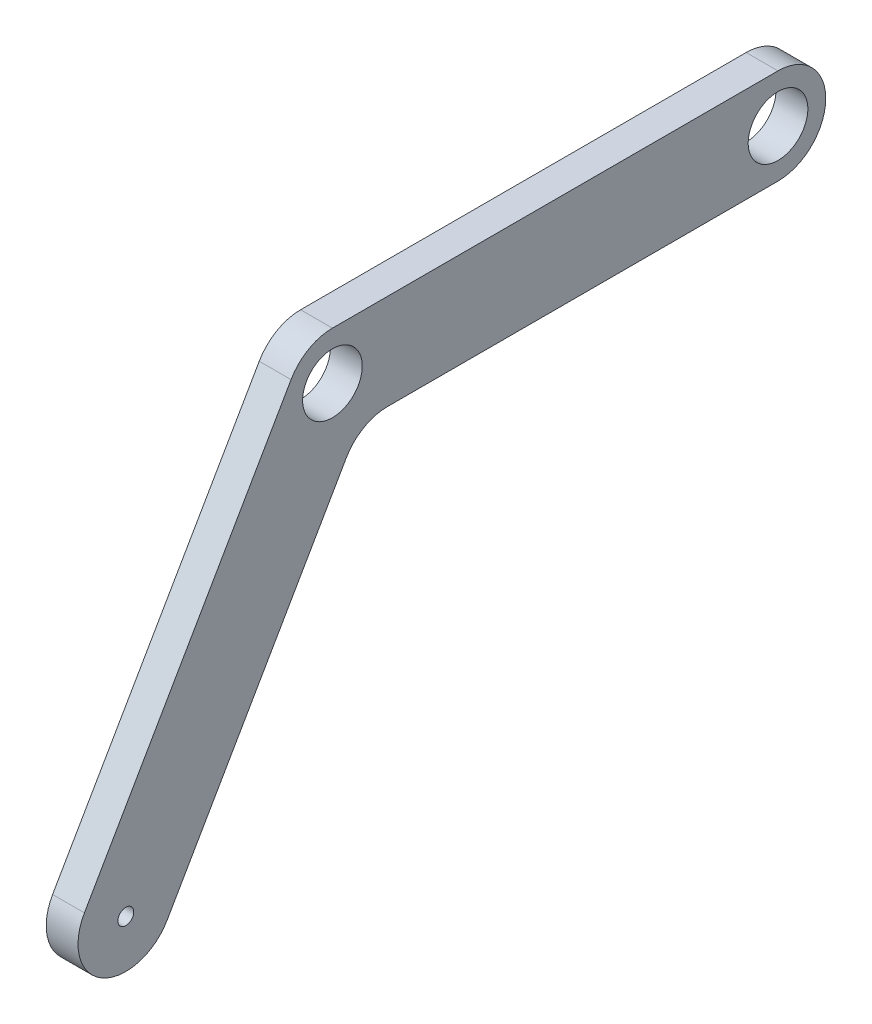
ISO-10303-21;
HEADER;
FILE_DESCRIPTION(('STEP AP214'),'2;1');
FILE_NAME('part.step','',(''),(''),'','','');
FILE_SCHEMA(('AUTOMOTIVE_DESIGN { 1 0 10303 214 1 1 1 1 }'));
ENDSEC;
DATA;
#1=APPLICATION_CONTEXT('core data for automotive mechanical design processes');
#2=APPLICATION_PROTOCOL_DEFINITION('international standard','automotive_design',2000,#1);
#3=PRODUCT_CONTEXT('',#1,'mechanical');
#4=PRODUCT('Part','Part','',(#3));
#5=PRODUCT_RELATED_PRODUCT_CATEGORY('part','',(#4));
#6=PRODUCT_DEFINITION_FORMATION('','',#4);
#7=PRODUCT_DEFINITION_CONTEXT('part definition',#1,'design');
#8=PRODUCT_DEFINITION('design','',#6,#7);
#9=PRODUCT_DEFINITION_SHAPE('','',#8);
#10=(LENGTH_UNIT() NAMED_UNIT(*) SI_UNIT(.MILLI.,.METRE.));
#11=(NAMED_UNIT(*) PLANE_ANGLE_UNIT() SI_UNIT($,.RADIAN.));
#12=(NAMED_UNIT(*) SI_UNIT($,.STERADIAN.) SOLID_ANGLE_UNIT());
#13=UNCERTAINTY_MEASURE_WITH_UNIT(LENGTH_MEASURE(1.E-05),#10,'distance_accuracy_value','');
#14=(GEOMETRIC_REPRESENTATION_CONTEXT(3) GLOBAL_UNCERTAINTY_ASSIGNED_CONTEXT((#13)) GLOBAL_UNIT_ASSIGNED_CONTEXT((#10,
#11,#12)) REPRESENTATION_CONTEXT('',''));
#15=CARTESIAN_POINT('',(0.,0.,0.));
#16=DIRECTION('',(0.,0.,1.));
#17=DIRECTION('',(1.,0.,0.));
#18=AXIS2_PLACEMENT_3D('',#15,#16,#17);
#19=CARTESIAN_POINT('',(-50.,-150.,-86.6717052534844));
#20=DIRECTION('',(-1.,0.,0.));
#21=DIRECTION('',(0.,0.,1.));
#22=AXIS2_PLACEMENT_3D('',#19,#20,#21);
#23=PLANE('',#22);
#24=CARTESIAN_POINT('',(-50.,0.,0.));
#25=DIRECTION('',(-1.,0.,0.));
#26=DIRECTION('',(0.,0.,1.));
#27=AXIS2_PLACEMENT_3D('',#24,#25,#26);
#28=CIRCLE('',#27,46.875);
#29=CARTESIAN_POINT('',(-50.,0.,46.875));
#30=VERTEX_POINT('',#29);
#31=EDGE_CURVE('E181',#30,#30,#28,.T.);
#32=ORIENTED_EDGE('',*,*,#31,.F.);
#33=EDGE_LOOP('',(#32));
#34=FACE_BOUND('',#33,.T.);
#35=CARTESIAN_POINT('',(-50.,-150.,-86.6717052534844));
#36=DIRECTION('',(1.,0.,0.));
#37=DIRECTION('',(0.,0.,1.));
#38=AXIS2_PLACEMENT_3D('',#35,#36,#37);
#39=CIRCLE('',#38,75.);
#40=CARTESIAN_POINT('',(-50.,-75.,-86.6717052534844));
#41=VERTEX_POINT('',#40);
#42=CARTESIAN_POINT('',(-50.,-112.544923896965,-21.6938838517485));
#43=VERTEX_POINT('',#42);
#44=EDGE_CURVE('E144',#41,#43,#39,.T.);
#45=ORIENTED_EDGE('',*,*,#44,.T.);
#46=DIRECTION('',(0.,-0.866370952023145,0.499401014707129));
#47=VECTOR('',#46,1.);
#48=CARTESIAN_POINT('',(-50.,-112.544923896965,-21.6938838517485));
#49=LINE('',#48,#47);
#50=CARTESIAN_POINT('',(-50.,-600.596194918079,259.632838157898));
#51=VERTEX_POINT('',#50);
#52=EDGE_CURVE('E92',#43,#51,#49,.T.);
#53=ORIENTED_EDGE('',*,*,#52,.T.);
#54=CARTESIAN_POINT('',(-50.,-563.141118815044,324.610659559634));
#55=DIRECTION('',(-1.,0.,0.));
#56=DIRECTION('',(0.,0.,1.));
#57=AXIS2_PLACEMENT_3D('',#54,#55,#56);
#58=CIRCLE('',#57,75.);
#59=CARTESIAN_POINT('',(-50.,-525.68604271201,389.588480961369));
#60=VERTEX_POINT('',#59);
#61=EDGE_CURVE('E159',#51,#60,#58,.T.);
#62=ORIENTED_EDGE('',*,*,#61,.T.);
#63=DIRECTION('',(0.,0.866370952023145,-0.499401014707129));
#64=VECTOR('',#63,1.);
#65=CARTESIAN_POINT('',(-50.,37.4550761030346,64.9778214017358));
#66=LINE('',#65,#64);
#67=CARTESIAN_POINT('',(-50.,37.4550761030346,64.9778214017358));
#68=VERTEX_POINT('',#67);
#69=EDGE_CURVE('E172',#60,#68,#66,.T.);
#70=ORIENTED_EDGE('',*,*,#69,.T.);
#71=CARTESIAN_POINT('',(-50.,0.,0.));
#72=DIRECTION('',(-1.,0.,0.));
#73=DIRECTION('',(0.,0.,1.));
#74=AXIS2_PLACEMENT_3D('',#71,#72,#73);
#75=CIRCLE('',#74,75.);
#76=CARTESIAN_POINT('',(-50.,75.,0.));
#77=VERTEX_POINT('',#76);
#78=EDGE_CURVE('E111',#68,#77,#75,.T.);
#79=ORIENTED_EDGE('',*,*,#78,.T.);
#80=DIRECTION('',(0.,0.,-1.));
#81=VECTOR('',#80,1.);
#82=CARTESIAN_POINT('',(-50.,75.,0.));
#83=LINE('',#82,#81);
#84=CARTESIAN_POINT('',(-50.,74.9999999999999,-700.));
#85=VERTEX_POINT('',#84);
#86=EDGE_CURVE('E105',#77,#85,#83,.T.);
#87=ORIENTED_EDGE('',*,*,#86,.T.);
#88=CARTESIAN_POINT('',(-50.,0.,-700.));
#89=DIRECTION('',(-1.,0.,0.));
#90=DIRECTION('',(0.,0.,1.));
#91=AXIS2_PLACEMENT_3D('',#88,#89,#90);
#92=CIRCLE('',#91,75.);
#93=CARTESIAN_POINT('',(-50.,-75.,-700.));
#94=VERTEX_POINT('',#93);
#95=EDGE_CURVE('E109',#85,#94,#92,.T.);
#96=ORIENTED_EDGE('',*,*,#95,.T.);
#97=DIRECTION('',(0.,0.,1.));
#98=VECTOR('',#97,1.);
#99=CARTESIAN_POINT('',(-50.,-75.,-86.6717052534844));
#100=LINE('',#99,#98);
#101=EDGE_CURVE('E49',#94,#41,#100,.T.);
#102=ORIENTED_EDGE('',*,*,#101,.T.);
#103=EDGE_LOOP('',(#45,#53,#62,#70,#79,#87,#96,#102));
#104=FACE_BOUND('',#103,.T.);
#105=CARTESIAN_POINT('',(-50.,0.,-700.));
#106=DIRECTION('',(-1.,0.,0.));
#107=DIRECTION('',(0.,0.,1.));
#108=AXIS2_PLACEMENT_3D('',#105,#106,#107);
#109=CIRCLE('',#108,46.875);
#110=CARTESIAN_POINT('',(-50.,0.,-653.125));
#111=VERTEX_POINT('',#110);
#112=EDGE_CURVE('E133',#111,#111,#109,.T.);
#113=ORIENTED_EDGE('',*,*,#112,.F.);
#114=EDGE_LOOP('',(#113));
#115=FACE_BOUND('',#114,.T.);
#116=CARTESIAN_POINT('',(-50.,-563.141118815045,324.610659559632));
#117=DIRECTION('',(-1.,0.,0.));
#118=DIRECTION('',(0.,0.,1.));
#119=AXIS2_PLACEMENT_3D('',#116,#117,#118);
#120=CIRCLE('',#119,12.5000000000018);
#121=CARTESIAN_POINT('',(-50.,-563.141118815045,337.110659559634));
#122=VERTEX_POINT('',#121);
#123=EDGE_CURVE('E187',#122,#122,#120,.T.);
#124=ORIENTED_EDGE('',*,*,#123,.F.);
#125=EDGE_LOOP('',(#124));
#126=FACE_BOUND('',#125,.T.);
#127=ADVANCED_FACE('F32',(#34,#104,#115,#126),#23,.T.);
#128=CARTESIAN_POINT('',(0.,-150.,-86.6717052534844));
#129=DIRECTION('',(-1.,0.,0.));
#130=DIRECTION('',(0.,0.,1.));
#131=AXIS2_PLACEMENT_3D('',#128,#129,#130);
#132=PLANE('',#131);
#133=CARTESIAN_POINT('',(0.,0.,0.));
#134=DIRECTION('',(-1.,0.,0.));
#135=DIRECTION('',(0.,0.,1.));
#136=AXIS2_PLACEMENT_3D('',#133,#134,#135);
#137=CIRCLE('',#136,46.875);
#138=CARTESIAN_POINT('',(0.,0.,46.875));
#139=VERTEX_POINT('',#138);
#140=EDGE_CURVE('E184',#139,#139,#137,.T.);
#141=ORIENTED_EDGE('',*,*,#140,.T.);
#142=EDGE_LOOP('',(#141));
#143=FACE_BOUND('',#142,.T.);
#144=CARTESIAN_POINT('',(0.,-150.,-86.6717052534844));
#145=DIRECTION('',(1.,0.,0.));
#146=DIRECTION('',(0.,0.,1.));
#147=AXIS2_PLACEMENT_3D('',#144,#145,#146);
#148=CIRCLE('',#147,75.);
#149=CARTESIAN_POINT('',(0.,-75.,-86.6717052534844));
#150=VERTEX_POINT('',#149);
#151=CARTESIAN_POINT('',(0.,-112.544923896965,-21.6938838517485));
#152=VERTEX_POINT('',#151);
#153=EDGE_CURVE('E129',#150,#152,#148,.T.);
#154=ORIENTED_EDGE('',*,*,#153,.F.);
#155=DIRECTION('',(0.,0.,1.));
#156=VECTOR('',#155,1.);
#157=CARTESIAN_POINT('',(0.,-75.,-86.6717052534844));
#158=LINE('',#157,#156);
#159=CARTESIAN_POINT('',(0.,-75.,-700.));
#160=VERTEX_POINT('',#159);
#161=EDGE_CURVE('E84',#160,#150,#158,.T.);
#162=ORIENTED_EDGE('',*,*,#161,.F.);
#163=CARTESIAN_POINT('',(0.,0.,-700.));
#164=DIRECTION('',(-1.,0.,0.));
#165=DIRECTION('',(0.,0.,1.));
#166=AXIS2_PLACEMENT_3D('',#163,#164,#165);
#167=CIRCLE('',#166,75.);
#168=CARTESIAN_POINT('',(0.,74.9999999999999,-700.));
#169=VERTEX_POINT('',#168);
#170=EDGE_CURVE('E78',#169,#160,#167,.T.);
#171=ORIENTED_EDGE('',*,*,#170,.F.);
#172=DIRECTION('',(0.,0.,-1.));
#173=VECTOR('',#172,1.);
#174=CARTESIAN_POINT('',(0.,75.,0.));
#175=LINE('',#174,#173);
#176=CARTESIAN_POINT('',(0.,75.,0.));
#177=VERTEX_POINT('',#176);
#178=EDGE_CURVE('E119',#177,#169,#175,.T.);
#179=ORIENTED_EDGE('',*,*,#178,.F.);
#180=CARTESIAN_POINT('',(0.,0.,0.));
#181=DIRECTION('',(-1.,0.,0.));
#182=DIRECTION('',(0.,0.,1.));
#183=AXIS2_PLACEMENT_3D('',#180,#181,#182);
#184=CIRCLE('',#183,75.);
#185=CARTESIAN_POINT('',(0.,37.4550761030346,64.9778214017358));
#186=VERTEX_POINT('',#185);
#187=EDGE_CURVE('E139',#186,#177,#184,.T.);
#188=ORIENTED_EDGE('',*,*,#187,.F.);
#189=DIRECTION('',(0.,0.866370952023145,-0.499401014707129));
#190=VECTOR('',#189,1.);
#191=CARTESIAN_POINT('',(0.,37.4550761030346,64.9778214017358));
#192=LINE('',#191,#190);
#193=CARTESIAN_POINT('',(0.,-525.68604271201,389.588480961369));
#194=VERTEX_POINT('',#193);
#195=EDGE_CURVE('E137',#194,#186,#192,.T.);
#196=ORIENTED_EDGE('',*,*,#195,.F.);
#197=CARTESIAN_POINT('',(0.,-563.141118815044,324.610659559634));
#198=DIRECTION('',(-1.,0.,0.));
#199=DIRECTION('',(0.,0.,1.));
#200=AXIS2_PLACEMENT_3D('',#197,#198,#199);
#201=CIRCLE('',#200,75.);
#202=CARTESIAN_POINT('',(0.,-600.596194918079,259.632838157898));
#203=VERTEX_POINT('',#202);
#204=EDGE_CURVE('E135',#203,#194,#201,.T.);
#205=ORIENTED_EDGE('',*,*,#204,.F.);
#206=DIRECTION('',(0.,-0.866370952023145,0.499401014707129));
#207=VECTOR('',#206,1.);
#208=CARTESIAN_POINT('',(0.,-112.544923896965,-21.6938838517485));
#209=LINE('',#208,#207);
#210=EDGE_CURVE('E132',#152,#203,#209,.T.);
#211=ORIENTED_EDGE('',*,*,#210,.F.);
#212=EDGE_LOOP('',(#154,#162,#171,#179,#188,#196,#205,#211));
#213=FACE_BOUND('',#212,.T.);
#214=CARTESIAN_POINT('',(0.,0.,-700.));
#215=DIRECTION('',(-1.,0.,0.));
#216=DIRECTION('',(0.,0.,1.));
#217=AXIS2_PLACEMENT_3D('',#214,#215,#216);
#218=CIRCLE('',#217,46.875);
#219=CARTESIAN_POINT('',(0.,0.,-653.125));
#220=VERTEX_POINT('',#219);
#221=EDGE_CURVE('E178',#220,#220,#218,.T.);
#222=ORIENTED_EDGE('',*,*,#221,.T.);
#223=EDGE_LOOP('',(#222));
#224=FACE_BOUND('',#223,.T.);
#225=CARTESIAN_POINT('',(0.,-563.141118815045,324.610659559632));
#226=DIRECTION('',(-1.,0.,0.));
#227=DIRECTION('',(0.,0.,1.));
#228=AXIS2_PLACEMENT_3D('',#225,#226,#227);
#229=CIRCLE('',#228,12.5000000000018);
#230=CARTESIAN_POINT('',(0.,-563.141118815045,337.110659559634));
#231=VERTEX_POINT('',#230);
#232=EDGE_CURVE('E190',#231,#231,#229,.T.);
#233=ORIENTED_EDGE('',*,*,#232,.T.);
#234=EDGE_LOOP('',(#233));
#235=FACE_BOUND('',#234,.T.);
#236=ADVANCED_FACE('F163',(#143,#213,#224,#235),#132,.F.);
#237=CARTESIAN_POINT('',(-50.,-150.,-86.6717052534844));
#238=DIRECTION('',(1.,0.,0.));
#239=DIRECTION('',(0.,0.,-1.));
#240=AXIS2_PLACEMENT_3D('',#237,#238,#239);
#241=CYLINDRICAL_SURFACE('',#240,75.);
#242=ORIENTED_EDGE('',*,*,#153,.T.);
#243=DIRECTION('',(1.,0.,0.));
#244=VECTOR('',#243,1.);
#245=CARTESIAN_POINT('',(-50.,-112.544923896965,-21.6938838517485));
#246=LINE('',#245,#244);
#247=EDGE_CURVE('E11',#43,#152,#246,.T.);
#248=ORIENTED_EDGE('',*,*,#247,.F.);
#249=ORIENTED_EDGE('',*,*,#44,.F.);
#250=DIRECTION('',(1.,0.,0.));
#251=VECTOR('',#250,1.);
#252=CARTESIAN_POINT('',(-50.,-75.,-86.6717052534844));
#253=LINE('',#252,#251);
#254=EDGE_CURVE('E125',#41,#150,#253,.T.);
#255=ORIENTED_EDGE('',*,*,#254,.T.);
#256=EDGE_LOOP('',(#242,#248,#249,#255));
#257=FACE_BOUND('',#256,.T.);
#258=ADVANCED_FACE('F34',(#257),#241,.F.);
#259=CARTESIAN_POINT('',(-50.,-112.544923896965,-21.6938838517485));
#260=DIRECTION('',(0.,0.499401014707129,0.866370952023145));
#261=DIRECTION('',(0.,-0.866370952023145,0.499401014707129));
#262=AXIS2_PLACEMENT_3D('',#259,#260,#261);
#263=PLANE('',#262);
#264=ORIENTED_EDGE('',*,*,#210,.T.);
#265=DIRECTION('',(1.,0.,0.));
#266=VECTOR('',#265,1.);
#267=CARTESIAN_POINT('',(-50.,-600.596194918079,259.632838157898));
#268=LINE('',#267,#266);
#269=EDGE_CURVE('E41',#51,#203,#268,.T.);
#270=ORIENTED_EDGE('',*,*,#269,.F.);
#271=ORIENTED_EDGE('',*,*,#52,.F.);
#272=ORIENTED_EDGE('',*,*,#247,.T.);
#273=EDGE_LOOP('',(#264,#270,#271,#272));
#274=FACE_BOUND('',#273,.T.);
#275=ADVANCED_FACE('F224',(#274),#263,.F.);
#276=CARTESIAN_POINT('',(-50.,-563.141118815044,324.610659559634));
#277=DIRECTION('',(1.,0.,0.));
#278=DIRECTION('',(0.,0.,-1.));
#279=AXIS2_PLACEMENT_3D('',#276,#277,#278);
#280=CYLINDRICAL_SURFACE('',#279,75.);
#281=ORIENTED_EDGE('',*,*,#204,.T.);
#282=DIRECTION('',(1.,0.,0.));
#283=VECTOR('',#282,1.);
#284=CARTESIAN_POINT('',(-50.,-525.68604271201,389.588480961369));
#285=LINE('',#284,#283);
#286=EDGE_CURVE('E151',#60,#194,#285,.T.);
#287=ORIENTED_EDGE('',*,*,#286,.F.);
#288=ORIENTED_EDGE('',*,*,#61,.F.);
#289=ORIENTED_EDGE('',*,*,#269,.T.);
#290=EDGE_LOOP('',(#281,#287,#288,#289));
#291=FACE_BOUND('',#290,.T.);
#292=ADVANCED_FACE('F157',(#291),#280,.T.);
#293=CARTESIAN_POINT('',(-50.,37.4550761030346,64.9778214017358));
#294=DIRECTION('',(0.,-0.499401014707129,-0.866370952023145));
#295=DIRECTION('',(0.,0.866370952023145,-0.499401014707129));
#296=AXIS2_PLACEMENT_3D('',#293,#294,#295);
#297=PLANE('',#296);
#298=ORIENTED_EDGE('',*,*,#195,.T.);
#299=DIRECTION('',(1.,0.,0.));
#300=VECTOR('',#299,1.);
#301=CARTESIAN_POINT('',(-50.,37.4550761030346,64.9778214017358));
#302=LINE('',#301,#300);
#303=EDGE_CURVE('E148',#68,#186,#302,.T.);
#304=ORIENTED_EDGE('',*,*,#303,.F.);
#305=ORIENTED_EDGE('',*,*,#69,.F.);
#306=ORIENTED_EDGE('',*,*,#286,.T.);
#307=EDGE_LOOP('',(#298,#304,#305,#306));
#308=FACE_BOUND('',#307,.T.);
#309=ADVANCED_FACE('F168',(#308),#297,.F.);
#310=CARTESIAN_POINT('',(-50.,0.,0.));
#311=DIRECTION('',(1.,0.,0.));
#312=DIRECTION('',(0.,0.,-1.));
#313=AXIS2_PLACEMENT_3D('',#310,#311,#312);
#314=CYLINDRICAL_SURFACE('',#313,75.);
#315=ORIENTED_EDGE('',*,*,#187,.T.);
#316=DIRECTION('',(1.,0.,0.));
#317=VECTOR('',#316,1.);
#318=CARTESIAN_POINT('',(-50.,75.,0.));
#319=LINE('',#318,#317);
#320=EDGE_CURVE('E120',#77,#177,#319,.T.);
#321=ORIENTED_EDGE('',*,*,#320,.F.);
#322=ORIENTED_EDGE('',*,*,#78,.F.);
#323=ORIENTED_EDGE('',*,*,#303,.T.);
#324=EDGE_LOOP('',(#315,#321,#322,#323));
#325=FACE_BOUND('',#324,.T.);
#326=ADVANCED_FACE('F171',(#325),#314,.T.);
#327=CARTESIAN_POINT('',(-50.,75.,0.));
#328=DIRECTION('',(0.,-1.,0.));
#329=DIRECTION('',(0.,0.,-1.));
#330=AXIS2_PLACEMENT_3D('',#327,#328,#329);
#331=PLANE('',#330);
#332=ORIENTED_EDGE('',*,*,#178,.T.);
#333=DIRECTION('',(1.,0.,0.));
#334=VECTOR('',#333,1.);
#335=CARTESIAN_POINT('',(-50.,74.9999999999999,-700.));
#336=LINE('',#335,#334);
#337=EDGE_CURVE('E116',#85,#169,#336,.T.);
#338=ORIENTED_EDGE('',*,*,#337,.F.);
#339=ORIENTED_EDGE('',*,*,#86,.F.);
#340=ORIENTED_EDGE('',*,*,#320,.T.);
#341=EDGE_LOOP('',(#332,#338,#339,#340));
#342=FACE_BOUND('',#341,.T.);
#343=ADVANCED_FACE('F117',(#342),#331,.F.);
#344=CARTESIAN_POINT('',(-50.,0.,-700.));
#345=DIRECTION('',(1.,0.,0.));
#346=DIRECTION('',(0.,0.,-1.));
#347=AXIS2_PLACEMENT_3D('',#344,#345,#346);
#348=CYLINDRICAL_SURFACE('',#347,75.);
#349=ORIENTED_EDGE('',*,*,#170,.T.);
#350=DIRECTION('',(1.,0.,0.));
#351=VECTOR('',#350,1.);
#352=CARTESIAN_POINT('',(-50.,-75.,-700.));
#353=LINE('',#352,#351);
#354=EDGE_CURVE('E121',#94,#160,#353,.T.);
#355=ORIENTED_EDGE('',*,*,#354,.F.);
#356=ORIENTED_EDGE('',*,*,#95,.F.);
#357=ORIENTED_EDGE('',*,*,#337,.T.);
#358=EDGE_LOOP('',(#349,#355,#356,#357));
#359=FACE_BOUND('',#358,.T.);
#360=ADVANCED_FACE('F123',(#359),#348,.T.);
#361=CARTESIAN_POINT('',(-50.,-75.,-86.6717052534844));
#362=DIRECTION('',(0.,1.,0.));
#363=DIRECTION('',(0.,0.,1.));
#364=AXIS2_PLACEMENT_3D('',#361,#362,#363);
#365=PLANE('',#364);
#366=ORIENTED_EDGE('',*,*,#161,.T.);
#367=ORIENTED_EDGE('',*,*,#254,.F.);
#368=ORIENTED_EDGE('',*,*,#101,.F.);
#369=ORIENTED_EDGE('',*,*,#354,.T.);
#370=EDGE_LOOP('',(#366,#367,#368,#369));
#371=FACE_BOUND('',#370,.T.);
#372=ADVANCED_FACE('F212',(#371),#365,.F.);
#373=CARTESIAN_POINT('',(-50.,0.,-700.));
#374=DIRECTION('',(1.,0.,0.));
#375=DIRECTION('',(0.,0.,-1.));
#376=AXIS2_PLACEMENT_3D('',#373,#374,#375);
#377=CYLINDRICAL_SURFACE('',#376,46.875);
#378=ORIENTED_EDGE('',*,*,#112,.T.);
#379=EDGE_LOOP('',(#378));
#380=FACE_BOUND('',#379,.T.);
#381=ORIENTED_EDGE('',*,*,#221,.F.);
#382=EDGE_LOOP('',(#381));
#383=FACE_BOUND('',#382,.T.);
#384=ADVANCED_FACE('F209',(#380,#383),#377,.F.);
#385=CARTESIAN_POINT('',(-50.,0.,0.));
#386=DIRECTION('',(1.,0.,0.));
#387=DIRECTION('',(0.,0.,-1.));
#388=AXIS2_PLACEMENT_3D('',#385,#386,#387);
#389=CYLINDRICAL_SURFACE('',#388,46.875);
#390=ORIENTED_EDGE('',*,*,#31,.T.);
#391=EDGE_LOOP('',(#390));
#392=FACE_BOUND('',#391,.T.);
#393=ORIENTED_EDGE('',*,*,#140,.F.);
#394=EDGE_LOOP('',(#393));
#395=FACE_BOUND('',#394,.T.);
#396=ADVANCED_FACE('F288',(#392,#395),#389,.F.);
#397=CARTESIAN_POINT('',(-50.,-563.141118815045,324.610659559632));
#398=DIRECTION('',(1.,0.,0.));
#399=DIRECTION('',(0.,0.,-1.));
#400=AXIS2_PLACEMENT_3D('',#397,#398,#399);
#401=CYLINDRICAL_SURFACE('',#400,12.5000000000018);
#402=ORIENTED_EDGE('',*,*,#123,.T.);
#403=EDGE_LOOP('',(#402));
#404=FACE_BOUND('',#403,.T.);
#405=ORIENTED_EDGE('',*,*,#232,.F.);
#406=EDGE_LOOP('',(#405));
#407=FACE_BOUND('',#406,.T.);
#408=ADVANCED_FACE('F196',(#404,#407),#401,.F.);
#409=CLOSED_SHELL('',(#127,#236,#258,#275,#292,#309,#326,#343,#360,#372,#384,#396,#408));
#410=MANIFOLD_SOLID_BREP('B2',#409);
#411=ADVANCED_BREP_SHAPE_REPRESENTATION('',(#18,#410),#14);
#412=SHAPE_DEFINITION_REPRESENTATION(#9,#411);
ENDSEC;
END-ISO-10303-21;
